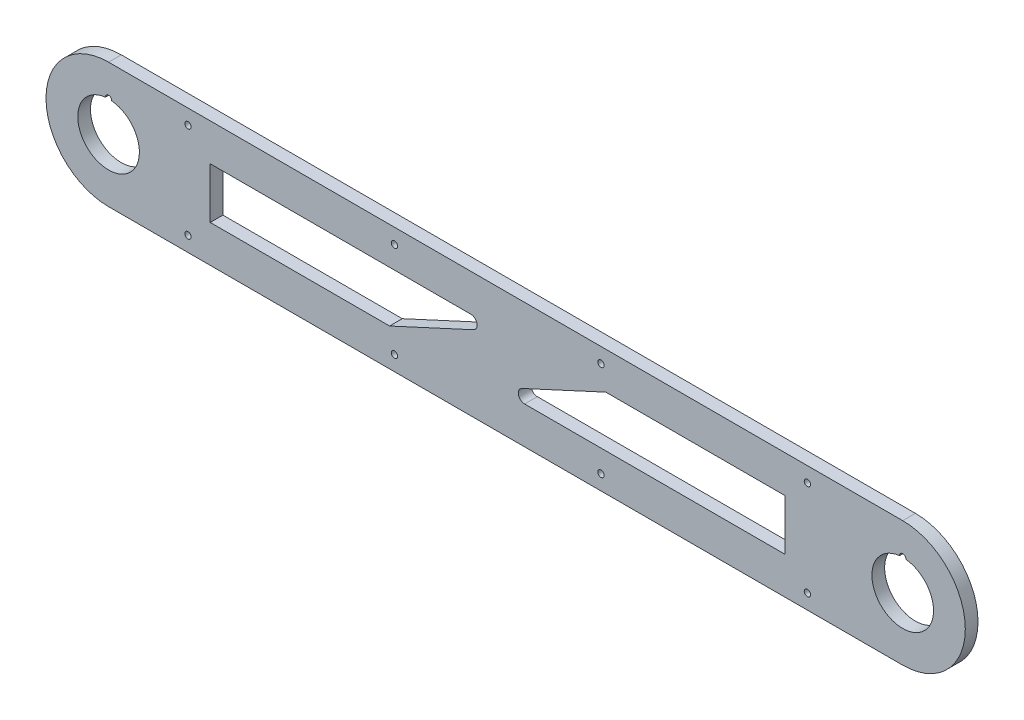
ISO-10303-21;
HEADER;
FILE_DESCRIPTION(('STEP AP214'),'2;1');
FILE_NAME('part.step','',(''),(''),'','','');
FILE_SCHEMA(('AUTOMOTIVE_DESIGN { 1 0 10303 214 1 1 1 1 }'));
ENDSEC;
DATA;
#1=APPLICATION_CONTEXT('core data for automotive mechanical design processes');
#2=APPLICATION_PROTOCOL_DEFINITION('international standard','automotive_design',2000,#1);
#3=PRODUCT_CONTEXT('',#1,'mechanical');
#4=PRODUCT('Part','Part','',(#3));
#5=PRODUCT_RELATED_PRODUCT_CATEGORY('part','',(#4));
#6=PRODUCT_DEFINITION_FORMATION('','',#4);
#7=PRODUCT_DEFINITION_CONTEXT('part definition',#1,'design');
#8=PRODUCT_DEFINITION('design','',#6,#7);
#9=PRODUCT_DEFINITION_SHAPE('','',#8);
#10=(LENGTH_UNIT() NAMED_UNIT(*) SI_UNIT(.MILLI.,.METRE.));
#11=(NAMED_UNIT(*) PLANE_ANGLE_UNIT() SI_UNIT($,.RADIAN.));
#12=(NAMED_UNIT(*) SI_UNIT($,.STERADIAN.) SOLID_ANGLE_UNIT());
#13=UNCERTAINTY_MEASURE_WITH_UNIT(LENGTH_MEASURE(1.E-05),#10,'distance_accuracy_value','');
#14=(GEOMETRIC_REPRESENTATION_CONTEXT(3) GLOBAL_UNCERTAINTY_ASSIGNED_CONTEXT((#13)) GLOBAL_UNIT_ASSIGNED_CONTEXT((#10,
#11,#12)) REPRESENTATION_CONTEXT('',''));
#15=CARTESIAN_POINT('',(0.,0.,0.));
#16=DIRECTION('',(0.,0.,1.));
#17=DIRECTION('',(1.,0.,0.));
#18=AXIS2_PLACEMENT_3D('',#15,#16,#17);
#19=CARTESIAN_POINT('',(0.,0.,4.));
#20=DIRECTION('',(0.,0.,1.));
#21=DIRECTION('',(1.,0.,0.));
#22=AXIS2_PLACEMENT_3D('',#19,#20,#21);
#23=PLANE('',#22);
#24=CARTESIAN_POINT('',(0.,9.7,4.));
#25=DIRECTION('',(0.,0.,1.));
#26=DIRECTION('',(1.,0.,0.));
#27=AXIS2_PLACEMENT_3D('',#24,#25,#26);
#28=CIRCLE('',#27,1.);
#29=CARTESIAN_POINT('',(0.998670601097925,9.64845360824742,4.));
#30=VERTEX_POINT('',#29);
#31=CARTESIAN_POINT('',(-0.998670601097925,9.64845360824742,4.));
#32=VERTEX_POINT('',#31);
#33=EDGE_CURVE('E53',#30,#32,#28,.T.);
#34=ORIENTED_EDGE('',*,*,#33,.F.);
#35=CARTESIAN_POINT('',(0.,0.,4.));
#36=DIRECTION('',(0.,0.,1.));
#37=DIRECTION('',(1.,0.,0.));
#38=AXIS2_PLACEMENT_3D('',#35,#36,#37);
#39=CIRCLE('',#38,9.7);
#40=EDGE_CURVE('E186',#32,#30,#39,.T.);
#41=ORIENTED_EDGE('',*,*,#40,.F.);
#42=EDGE_LOOP('',(#34,#41));
#43=FACE_BOUND('',#42,.T.);
#44=CARTESIAN_POINT('',(250.,9.69999999999999,4.));
#45=DIRECTION('',(0.,0.,1.));
#46=DIRECTION('',(1.,0.,0.));
#47=AXIS2_PLACEMENT_3D('',#44,#45,#46);
#48=CIRCLE('',#47,0.999999999999998);
#49=CARTESIAN_POINT('',(250.998670601098,9.64845360824742,4.));
#50=VERTEX_POINT('',#49);
#51=CARTESIAN_POINT('',(249.001329398902,9.64845360824742,4.));
#52=VERTEX_POINT('',#51);
#53=EDGE_CURVE('E61',#50,#52,#48,.T.);
#54=ORIENTED_EDGE('',*,*,#53,.F.);
#55=CARTESIAN_POINT('',(250.,0.,4.));
#56=DIRECTION('',(0.,0.,1.));
#57=DIRECTION('',(1.,0.,0.));
#58=AXIS2_PLACEMENT_3D('',#55,#56,#57);
#59=CIRCLE('',#58,9.7);
#60=EDGE_CURVE('E175',#52,#50,#59,.T.);
#61=ORIENTED_EDGE('',*,*,#60,.F.);
#62=EDGE_LOOP('',(#54,#61));
#63=FACE_BOUND('',#62,.T.);
#64=CARTESIAN_POINT('',(130.976731594915,-6.,4.));
#65=DIRECTION('',(0.,0.,1.));
#66=DIRECTION('',(-1.,0.,0.));
#67=AXIS2_PLACEMENT_3D('',#64,#65,#66);
#68=CIRCLE('',#67,2.);
#69=CARTESIAN_POINT('',(130.138615239991,-4.18408123099903,4.));
#70=VERTEX_POINT('',#69);
#71=CARTESIAN_POINT('',(130.976731594915,-8.,4.));
#72=VERTEX_POINT('',#71);
#73=EDGE_CURVE('E332',#70,#72,#68,.T.);
#74=ORIENTED_EDGE('',*,*,#73,.F.);
#75=DIRECTION('',(-0.907959384500451,-0.419058177461749,0.));
#76=VECTOR('',#75,1.);
#77=CARTESIAN_POINT('',(156.537457907156,8.,4.));
#78=LINE('',#77,#76);
#79=CARTESIAN_POINT('',(156.537457907156,8.,4.));
#80=VERTEX_POINT('',#79);
#81=EDGE_CURVE('E348',#80,#70,#78,.T.);
#82=ORIENTED_EDGE('',*,*,#81,.F.);
#83=DIRECTION('',(-1.,0.,0.));
#84=VECTOR('',#83,1.);
#85=CARTESIAN_POINT('',(156.537457907156,8.,4.));
#86=LINE('',#85,#84);
#87=CARTESIAN_POINT('',(213.,8.,4.));
#88=VERTEX_POINT('',#87);
#89=EDGE_CURVE('E344',#88,#80,#86,.T.);
#90=ORIENTED_EDGE('',*,*,#89,.F.);
#91=DIRECTION('',(0.,1.,0.));
#92=VECTOR('',#91,1.);
#93=CARTESIAN_POINT('',(213.,8.,4.));
#94=LINE('',#93,#92);
#95=CARTESIAN_POINT('',(213.,-8.,4.));
#96=VERTEX_POINT('',#95);
#97=EDGE_CURVE('E340',#96,#88,#94,.T.);
#98=ORIENTED_EDGE('',*,*,#97,.F.);
#99=DIRECTION('',(1.,0.,0.));
#100=VECTOR('',#99,1.);
#101=CARTESIAN_POINT('',(213.,-8.,4.));
#102=LINE('',#101,#100);
#103=EDGE_CURVE('E335',#72,#96,#102,.T.);
#104=ORIENTED_EDGE('',*,*,#103,.F.);
#105=EDGE_LOOP('',(#74,#82,#90,#98,#104));
#106=FACE_BOUND('',#105,.T.);
#107=DIRECTION('',(0.,-1.,0.));
#108=VECTOR('',#107,1.);
#109=CARTESIAN_POINT('',(32.0000000000003,-8.,4.));
#110=LINE('',#109,#108);
#111=CARTESIAN_POINT('',(32.0000000000003,8.,4.));
#112=VERTEX_POINT('',#111);
#113=CARTESIAN_POINT('',(32.0000000000003,-8.,4.));
#114=VERTEX_POINT('',#113);
#115=EDGE_CURVE('E323',#112,#114,#110,.T.);
#116=ORIENTED_EDGE('',*,*,#115,.F.);
#117=DIRECTION('',(-1.,0.,0.));
#118=VECTOR('',#117,1.);
#119=CARTESIAN_POINT('',(32.0000000000003,8.,4.));
#120=LINE('',#119,#118);
#121=CARTESIAN_POINT('',(114.023268405086,8.,4.));
#122=VERTEX_POINT('',#121);
#123=EDGE_CURVE('E383',#122,#112,#120,.T.);
#124=ORIENTED_EDGE('',*,*,#123,.F.);
#125=CARTESIAN_POINT('',(114.023268405086,6.,4.));
#126=DIRECTION('',(0.,0.,1.));
#127=DIRECTION('',(1.,0.,0.));
#128=AXIS2_PLACEMENT_3D('',#125,#126,#127);
#129=CIRCLE('',#128,2.);
#130=CARTESIAN_POINT('',(114.861384760009,4.18408123099904,4.));
#131=VERTEX_POINT('',#130);
#132=EDGE_CURVE('E379',#131,#122,#129,.T.);
#133=ORIENTED_EDGE('',*,*,#132,.F.);
#134=DIRECTION('',(0.907959384500451,0.419058177461749,0.));
#135=VECTOR('',#134,1.);
#136=CARTESIAN_POINT('',(114.861384760009,4.18408123099903,4.));
#137=LINE('',#136,#135);
#138=CARTESIAN_POINT('',(88.4625420928446,-8.,4.));
#139=VERTEX_POINT('',#138);
#140=EDGE_CURVE('E375',#139,#131,#137,.T.);
#141=ORIENTED_EDGE('',*,*,#140,.F.);
#142=DIRECTION('',(1.,0.,0.));
#143=VECTOR('',#142,1.);
#144=CARTESIAN_POINT('',(88.4625420928446,-8.,4.));
#145=LINE('',#144,#143);
#146=EDGE_CURVE('E371',#114,#139,#145,.T.);
#147=ORIENTED_EDGE('',*,*,#146,.F.);
#148=EDGE_LOOP('',(#116,#124,#133,#141,#147));
#149=FACE_BOUND('',#148,.T.);
#150=CARTESIAN_POINT('',(90.0000000000003,-15.,4.));
#151=DIRECTION('',(0.,0.,1.));
#152=DIRECTION('',(1.,0.,0.));
#153=AXIS2_PLACEMENT_3D('',#150,#151,#152);
#154=CIRCLE('',#153,0.999999999999998);
#155=CARTESIAN_POINT('',(91.0000000000003,-15.,4.));
#156=VERTEX_POINT('',#155);
#157=EDGE_CURVE('E406',#156,#156,#154,.T.);
#158=ORIENTED_EDGE('',*,*,#157,.F.);
#159=EDGE_LOOP('',(#158));
#160=FACE_BOUND('',#159,.T.);
#161=CARTESIAN_POINT('',(220.,15.,4.));
#162=DIRECTION('',(0.,0.,1.));
#163=DIRECTION('',(1.,0.,0.));
#164=AXIS2_PLACEMENT_3D('',#161,#162,#163);
#165=CIRCLE('',#164,0.999999999999998);
#166=CARTESIAN_POINT('',(221.,15.,4.));
#167=VERTEX_POINT('',#166);
#168=EDGE_CURVE('E414',#167,#167,#165,.T.);
#169=ORIENTED_EDGE('',*,*,#168,.F.);
#170=EDGE_LOOP('',(#169));
#171=FACE_BOUND('',#170,.T.);
#172=CARTESIAN_POINT('',(155.,15.,4.));
#173=DIRECTION('',(0.,0.,1.));
#174=DIRECTION('',(1.,0.,0.));
#175=AXIS2_PLACEMENT_3D('',#172,#173,#174);
#176=CIRCLE('',#175,0.999999999999998);
#177=CARTESIAN_POINT('',(156.,15.,4.));
#178=VERTEX_POINT('',#177);
#179=EDGE_CURVE('E418',#178,#178,#176,.T.);
#180=ORIENTED_EDGE('',*,*,#179,.F.);
#181=EDGE_LOOP('',(#180));
#182=FACE_BOUND('',#181,.T.);
#183=CARTESIAN_POINT('',(90.,15.,4.));
#184=DIRECTION('',(0.,0.,1.));
#185=DIRECTION('',(1.,0.,0.));
#186=AXIS2_PLACEMENT_3D('',#183,#184,#185);
#187=CIRCLE('',#186,1.00000000000001);
#188=CARTESIAN_POINT('',(91.,15.,4.));
#189=VERTEX_POINT('',#188);
#190=EDGE_CURVE('E422',#189,#189,#187,.T.);
#191=ORIENTED_EDGE('',*,*,#190,.F.);
#192=EDGE_LOOP('',(#191));
#193=FACE_BOUND('',#192,.T.);
#194=CARTESIAN_POINT('',(155.,-15.,4.));
#195=DIRECTION('',(0.,0.,1.));
#196=DIRECTION('',(1.,0.,0.));
#197=AXIS2_PLACEMENT_3D('',#194,#195,#196);
#198=CIRCLE('',#197,0.999999999999998);
#199=CARTESIAN_POINT('',(156.,-15.,4.));
#200=VERTEX_POINT('',#199);
#201=EDGE_CURVE('E402',#200,#200,#198,.T.);
#202=ORIENTED_EDGE('',*,*,#201,.F.);
#203=EDGE_LOOP('',(#202));
#204=FACE_BOUND('',#203,.T.);
#205=CARTESIAN_POINT('',(220.,-15.,4.));
#206=DIRECTION('',(0.,0.,1.));
#207=DIRECTION('',(1.,0.,0.));
#208=AXIS2_PLACEMENT_3D('',#205,#206,#207);
#209=CIRCLE('',#208,0.999999999999998);
#210=CARTESIAN_POINT('',(221.,-15.,4.));
#211=VERTEX_POINT('',#210);
#212=EDGE_CURVE('E407',#211,#211,#209,.T.);
#213=ORIENTED_EDGE('',*,*,#212,.F.);
#214=EDGE_LOOP('',(#213));
#215=FACE_BOUND('',#214,.T.);
#216=CARTESIAN_POINT('',(25.0000000000003,-15.,4.));
#217=DIRECTION('',(0.,0.,1.));
#218=DIRECTION('',(1.,0.,0.));
#219=AXIS2_PLACEMENT_3D('',#216,#217,#218);
#220=CIRCLE('',#219,1.);
#221=CARTESIAN_POINT('',(26.0000000000003,-15.,4.));
#222=VERTEX_POINT('',#221);
#223=EDGE_CURVE('E356',#222,#222,#220,.T.);
#224=ORIENTED_EDGE('',*,*,#223,.F.);
#225=EDGE_LOOP('',(#224));
#226=FACE_BOUND('',#225,.T.);
#227=CARTESIAN_POINT('',(25.,15.,4.));
#228=DIRECTION('',(0.,0.,1.));
#229=DIRECTION('',(1.,0.,0.));
#230=AXIS2_PLACEMENT_3D('',#227,#228,#229);
#231=CIRCLE('',#230,1.);
#232=CARTESIAN_POINT('',(26.,15.,4.));
#233=VERTEX_POINT('',#232);
#234=EDGE_CURVE('E191',#233,#233,#231,.T.);
#235=ORIENTED_EDGE('',*,*,#234,.F.);
#236=EDGE_LOOP('',(#235));
#237=FACE_BOUND('',#236,.T.);
#238=CARTESIAN_POINT('',(0.,0.,4.));
#239=DIRECTION('',(0.,0.,1.));
#240=DIRECTION('',(1.,0.,0.));
#241=AXIS2_PLACEMENT_3D('',#238,#239,#240);
#242=CIRCLE('',#241,19.7);
#243=CARTESIAN_POINT('',(0.,19.7,4.));
#244=VERTEX_POINT('',#243);
#245=CARTESIAN_POINT('',(0.,-19.7,4.));
#246=VERTEX_POINT('',#245);
#247=EDGE_CURVE('E198',#244,#246,#242,.T.);
#248=ORIENTED_EDGE('',*,*,#247,.T.);
#249=DIRECTION('',(1.,0.,0.));
#250=VECTOR('',#249,1.);
#251=CARTESIAN_POINT('',(0.,-19.7,4.));
#252=LINE('',#251,#250);
#253=CARTESIAN_POINT('',(250.,-19.7,4.));
#254=VERTEX_POINT('',#253);
#255=EDGE_CURVE('E202',#246,#254,#252,.T.);
#256=ORIENTED_EDGE('',*,*,#255,.T.);
#257=CARTESIAN_POINT('',(250.,0.,4.));
#258=DIRECTION('',(0.,0.,1.));
#259=DIRECTION('',(-1.,0.,0.));
#260=AXIS2_PLACEMENT_3D('',#257,#258,#259);
#261=CIRCLE('',#260,19.7);
#262=CARTESIAN_POINT('',(250.,19.7,4.));
#263=VERTEX_POINT('',#262);
#264=EDGE_CURVE('E206',#254,#263,#261,.T.);
#265=ORIENTED_EDGE('',*,*,#264,.T.);
#266=DIRECTION('',(-1.,0.,0.));
#267=VECTOR('',#266,1.);
#268=CARTESIAN_POINT('',(0.,19.7,4.));
#269=LINE('',#268,#267);
#270=EDGE_CURVE('E209',#263,#244,#269,.T.);
#271=ORIENTED_EDGE('',*,*,#270,.T.);
#272=EDGE_LOOP('',(#248,#256,#265,#271));
#273=FACE_BOUND('',#272,.T.);
#274=ADVANCED_FACE('F38',(#43,#63,#106,#149,#160,#171,#182,#193,#204,#215,#226,#237,#273),#23,.T.);
#275=CARTESIAN_POINT('',(0.,0.,0.));
#276=DIRECTION('',(0.,0.,1.));
#277=DIRECTION('',(1.,0.,0.));
#278=AXIS2_PLACEMENT_3D('',#275,#276,#277);
#279=PLANE('',#278);
#280=DIRECTION('',(-0.907959384500451,-0.419058177461749,0.));
#281=VECTOR('',#280,1.);
#282=CARTESIAN_POINT('',(24.4456023641837,-52.9654717890643,0.));
#283=LINE('',#282,#281);
#284=CARTESIAN_POINT('',(156.537457907156,8.,0.));
#285=VERTEX_POINT('',#284);
#286=CARTESIAN_POINT('',(130.138615239991,-4.18408123099903,0.));
#287=VERTEX_POINT('',#286);
#288=EDGE_CURVE('E302',#285,#287,#283,.T.);
#289=ORIENTED_EDGE('',*,*,#288,.T.);
#290=CARTESIAN_POINT('',(130.976731594915,-6.,0.));
#291=DIRECTION('',(0.,0.,1.));
#292=DIRECTION('',(1.,0.,0.));
#293=AXIS2_PLACEMENT_3D('',#290,#291,#292);
#294=CIRCLE('',#293,2.);
#295=CARTESIAN_POINT('',(130.976731594915,-8.,0.));
#296=VERTEX_POINT('',#295);
#297=EDGE_CURVE('E306',#287,#296,#294,.T.);
#298=ORIENTED_EDGE('',*,*,#297,.T.);
#299=DIRECTION('',(1.,0.,0.));
#300=VECTOR('',#299,1.);
#301=CARTESIAN_POINT('',(0.,-8.,0.));
#302=LINE('',#301,#300);
#303=CARTESIAN_POINT('',(213.,-8.,0.));
#304=VERTEX_POINT('',#303);
#305=EDGE_CURVE('E290',#296,#304,#302,.T.);
#306=ORIENTED_EDGE('',*,*,#305,.T.);
#307=DIRECTION('',(0.,1.,0.));
#308=VECTOR('',#307,1.);
#309=CARTESIAN_POINT('',(213.,0.,0.));
#310=LINE('',#309,#308);
#311=CARTESIAN_POINT('',(213.,8.,0.));
#312=VERTEX_POINT('',#311);
#313=EDGE_CURVE('E294',#304,#312,#310,.T.);
#314=ORIENTED_EDGE('',*,*,#313,.T.);
#315=DIRECTION('',(-1.,0.,0.));
#316=VECTOR('',#315,1.);
#317=CARTESIAN_POINT('',(0.,8.,0.));
#318=LINE('',#317,#316);
#319=EDGE_CURVE('E298',#312,#285,#318,.T.);
#320=ORIENTED_EDGE('',*,*,#319,.T.);
#321=EDGE_LOOP('',(#289,#298,#306,#314,#320));
#322=FACE_BOUND('',#321,.T.);
#323=DIRECTION('',(-1.,0.,0.));
#324=VECTOR('',#323,1.);
#325=CARTESIAN_POINT('',(0.,8.,0.));
#326=LINE('',#325,#324);
#327=CARTESIAN_POINT('',(114.023268405086,8.,0.));
#328=VERTEX_POINT('',#327);
#329=CARTESIAN_POINT('',(32.0000000000003,8.,0.));
#330=VERTEX_POINT('',#329);
#331=EDGE_CURVE('E282',#328,#330,#326,.T.);
#332=ORIENTED_EDGE('',*,*,#331,.T.);
#333=DIRECTION('',(0.,-1.,0.));
#334=VECTOR('',#333,1.);
#335=CARTESIAN_POINT('',(32.0000000000003,0.,0.));
#336=LINE('',#335,#334);
#337=CARTESIAN_POINT('',(32.0000000000003,-8.,0.));
#338=VERTEX_POINT('',#337);
#339=EDGE_CURVE('E286',#330,#338,#336,.T.);
#340=ORIENTED_EDGE('',*,*,#339,.T.);
#341=DIRECTION('',(1.,0.,0.));
#342=VECTOR('',#341,1.);
#343=CARTESIAN_POINT('',(0.,-8.,0.));
#344=LINE('',#343,#342);
#345=CARTESIAN_POINT('',(88.4625420928446,-8.,0.));
#346=VERTEX_POINT('',#345);
#347=EDGE_CURVE('E239',#338,#346,#344,.T.);
#348=ORIENTED_EDGE('',*,*,#347,.T.);
#349=DIRECTION('',(0.907959384500451,0.419058177461749,0.));
#350=VECTOR('',#349,1.);
#351=CARTESIAN_POINT('',(18.5787878797192,-40.254040406058,0.));
#352=LINE('',#351,#350);
#353=CARTESIAN_POINT('',(114.861384760009,4.18408123099904,0.));
#354=VERTEX_POINT('',#353);
#355=EDGE_CURVE('E274',#346,#354,#352,.T.);
#356=ORIENTED_EDGE('',*,*,#355,.T.);
#357=CARTESIAN_POINT('',(114.023268405086,6.,0.));
#358=DIRECTION('',(0.,0.,1.));
#359=DIRECTION('',(1.,0.,0.));
#360=AXIS2_PLACEMENT_3D('',#357,#358,#359);
#361=CIRCLE('',#360,2.);
#362=EDGE_CURVE('E278',#354,#328,#361,.T.);
#363=ORIENTED_EDGE('',*,*,#362,.T.);
#364=EDGE_LOOP('',(#332,#340,#348,#356,#363));
#365=FACE_BOUND('',#364,.T.);
#366=CARTESIAN_POINT('',(90.0000000000003,-15.,0.));
#367=DIRECTION('',(0.,0.,1.));
#368=DIRECTION('',(1.,0.,0.));
#369=AXIS2_PLACEMENT_3D('',#366,#367,#368);
#370=CIRCLE('',#369,0.999999999999998);
#371=CARTESIAN_POINT('',(91.0000000000003,-15.,0.));
#372=VERTEX_POINT('',#371);
#373=EDGE_CURVE('E188',#372,#372,#370,.T.);
#374=ORIENTED_EDGE('',*,*,#373,.T.);
#375=EDGE_LOOP('',(#374));
#376=FACE_BOUND('',#375,.T.);
#377=CARTESIAN_POINT('',(220.,15.,0.));
#378=DIRECTION('',(0.,0.,1.));
#379=DIRECTION('',(1.,0.,0.));
#380=AXIS2_PLACEMENT_3D('',#377,#378,#379);
#381=CIRCLE('',#380,0.999999999999998);
#382=CARTESIAN_POINT('',(221.,15.,0.));
#383=VERTEX_POINT('',#382);
#384=EDGE_CURVE('E264',#383,#383,#381,.T.);
#385=ORIENTED_EDGE('',*,*,#384,.T.);
#386=EDGE_LOOP('',(#385));
#387=FACE_BOUND('',#386,.T.);
#388=CARTESIAN_POINT('',(155.,15.,0.));
#389=DIRECTION('',(0.,0.,1.));
#390=DIRECTION('',(1.,0.,0.));
#391=AXIS2_PLACEMENT_3D('',#388,#389,#390);
#392=CIRCLE('',#391,0.999999999999998);
#393=CARTESIAN_POINT('',(156.,15.,0.));
#394=VERTEX_POINT('',#393);
#395=EDGE_CURVE('E260',#394,#394,#392,.T.);
#396=ORIENTED_EDGE('',*,*,#395,.T.);
#397=EDGE_LOOP('',(#396));
#398=FACE_BOUND('',#397,.T.);
#399=CARTESIAN_POINT('',(90.,15.,0.));
#400=DIRECTION('',(0.,0.,1.));
#401=DIRECTION('',(1.,0.,0.));
#402=AXIS2_PLACEMENT_3D('',#399,#400,#401);
#403=CIRCLE('',#402,1.00000000000001);
#404=CARTESIAN_POINT('',(91.,15.,0.));
#405=VERTEX_POINT('',#404);
#406=EDGE_CURVE('E256',#405,#405,#403,.T.);
#407=ORIENTED_EDGE('',*,*,#406,.T.);
#408=EDGE_LOOP('',(#407));
#409=FACE_BOUND('',#408,.T.);
#410=CARTESIAN_POINT('',(155.,-15.,0.));
#411=DIRECTION('',(0.,0.,1.));
#412=DIRECTION('',(1.,0.,0.));
#413=AXIS2_PLACEMENT_3D('',#410,#411,#412);
#414=CIRCLE('',#413,0.999999999999998);
#415=CARTESIAN_POINT('',(156.,-15.,0.));
#416=VERTEX_POINT('',#415);
#417=EDGE_CURVE('E252',#416,#416,#414,.T.);
#418=ORIENTED_EDGE('',*,*,#417,.T.);
#419=EDGE_LOOP('',(#418));
#420=FACE_BOUND('',#419,.T.);
#421=CARTESIAN_POINT('',(220.,-15.,0.));
#422=DIRECTION('',(0.,0.,1.));
#423=DIRECTION('',(1.,0.,0.));
#424=AXIS2_PLACEMENT_3D('',#421,#422,#423);
#425=CIRCLE('',#424,0.999999999999998);
#426=CARTESIAN_POINT('',(221.,-15.,0.));
#427=VERTEX_POINT('',#426);
#428=EDGE_CURVE('E248',#427,#427,#425,.T.);
#429=ORIENTED_EDGE('',*,*,#428,.T.);
#430=EDGE_LOOP('',(#429));
#431=FACE_BOUND('',#430,.T.);
#432=CARTESIAN_POINT('',(25.0000000000003,-15.,0.));
#433=DIRECTION('',(0.,0.,1.));
#434=DIRECTION('',(1.,0.,0.));
#435=AXIS2_PLACEMENT_3D('',#432,#433,#434);
#436=CIRCLE('',#435,1.);
#437=CARTESIAN_POINT('',(26.0000000000003,-15.,0.));
#438=VERTEX_POINT('',#437);
#439=EDGE_CURVE('E244',#438,#438,#436,.T.);
#440=ORIENTED_EDGE('',*,*,#439,.T.);
#441=EDGE_LOOP('',(#440));
#442=FACE_BOUND('',#441,.T.);
#443=CARTESIAN_POINT('',(25.,15.,0.));
#444=DIRECTION('',(0.,0.,1.));
#445=DIRECTION('',(1.,0.,0.));
#446=AXIS2_PLACEMENT_3D('',#443,#444,#445);
#447=CIRCLE('',#446,1.);
#448=CARTESIAN_POINT('',(26.,15.,0.));
#449=VERTEX_POINT('',#448);
#450=EDGE_CURVE('E240',#449,#449,#447,.T.);
#451=ORIENTED_EDGE('',*,*,#450,.T.);
#452=EDGE_LOOP('',(#451));
#453=FACE_BOUND('',#452,.T.);
#454=CARTESIAN_POINT('',(0.,0.,0.));
#455=DIRECTION('',(0.,0.,1.));
#456=DIRECTION('',(1.,0.,0.));
#457=AXIS2_PLACEMENT_3D('',#454,#455,#456);
#458=CIRCLE('',#457,19.7);
#459=CARTESIAN_POINT('',(0.,19.7,0.));
#460=VERTEX_POINT('',#459);
#461=CARTESIAN_POINT('',(0.,-19.7,0.));
#462=VERTEX_POINT('',#461);
#463=EDGE_CURVE('E196',#460,#462,#458,.T.);
#464=ORIENTED_EDGE('',*,*,#463,.F.);
#465=DIRECTION('',(-1.,0.,0.));
#466=VECTOR('',#465,1.);
#467=CARTESIAN_POINT('',(0.,19.7,0.));
#468=LINE('',#467,#466);
#469=CARTESIAN_POINT('',(250.,19.7,0.));
#470=VERTEX_POINT('',#469);
#471=EDGE_CURVE('E203',#470,#460,#468,.T.);
#472=ORIENTED_EDGE('',*,*,#471,.F.);
#473=CARTESIAN_POINT('',(250.,0.,0.));
#474=DIRECTION('',(0.,0.,1.));
#475=DIRECTION('',(-1.,0.,0.));
#476=AXIS2_PLACEMENT_3D('',#473,#474,#475);
#477=CIRCLE('',#476,19.7);
#478=CARTESIAN_POINT('',(250.,-19.7,0.));
#479=VERTEX_POINT('',#478);
#480=EDGE_CURVE('E219',#479,#470,#477,.T.);
#481=ORIENTED_EDGE('',*,*,#480,.F.);
#482=DIRECTION('',(1.,0.,0.));
#483=VECTOR('',#482,1.);
#484=CARTESIAN_POINT('',(0.,-19.7,0.));
#485=LINE('',#484,#483);
#486=EDGE_CURVE('E216',#462,#479,#485,.T.);
#487=ORIENTED_EDGE('',*,*,#486,.F.);
#488=EDGE_LOOP('',(#464,#472,#481,#487));
#489=FACE_BOUND('',#488,.T.);
#490=CARTESIAN_POINT('',(0.,0.,0.));
#491=DIRECTION('',(0.,0.,1.));
#492=DIRECTION('',(1.,0.,0.));
#493=AXIS2_PLACEMENT_3D('',#490,#491,#492);
#494=CIRCLE('',#493,9.7);
#495=CARTESIAN_POINT('',(-0.998670601097924,9.64845360824742,0.));
#496=VERTEX_POINT('',#495);
#497=CARTESIAN_POINT('',(0.998670601097931,9.64845360824742,0.));
#498=VERTEX_POINT('',#497);
#499=EDGE_CURVE('E180',#496,#498,#494,.T.);
#500=ORIENTED_EDGE('',*,*,#499,.T.);
#501=CARTESIAN_POINT('',(0.,9.7,0.));
#502=DIRECTION('',(0.,0.,1.));
#503=DIRECTION('',(1.,0.,0.));
#504=AXIS2_PLACEMENT_3D('',#501,#502,#503);
#505=CIRCLE('',#504,1.);
#506=EDGE_CURVE('E314',#498,#496,#505,.T.);
#507=ORIENTED_EDGE('',*,*,#506,.T.);
#508=EDGE_LOOP('',(#500,#507));
#509=FACE_BOUND('',#508,.T.);
#510=CARTESIAN_POINT('',(250.,0.,0.));
#511=DIRECTION('',(0.,0.,1.));
#512=DIRECTION('',(1.,0.,0.));
#513=AXIS2_PLACEMENT_3D('',#510,#511,#512);
#514=CIRCLE('',#513,9.7);
#515=CARTESIAN_POINT('',(249.001329398902,9.64845360824742,0.));
#516=VERTEX_POINT('',#515);
#517=CARTESIAN_POINT('',(250.998670601098,9.64845360824742,0.));
#518=VERTEX_POINT('',#517);
#519=EDGE_CURVE('E181',#516,#518,#514,.T.);
#520=ORIENTED_EDGE('',*,*,#519,.T.);
#521=CARTESIAN_POINT('',(250.,9.69999999999999,0.));
#522=DIRECTION('',(0.,0.,1.));
#523=DIRECTION('',(1.,0.,0.));
#524=AXIS2_PLACEMENT_3D('',#521,#522,#523);
#525=CIRCLE('',#524,0.999999999999998);
#526=EDGE_CURVE('E164',#518,#516,#525,.T.);
#527=ORIENTED_EDGE('',*,*,#526,.T.);
#528=EDGE_LOOP('',(#520,#527));
#529=FACE_BOUND('',#528,.T.);
#530=ADVANCED_FACE('F320',(#322,#365,#376,#387,#398,#409,#420,#431,#442,#453,#489,#509,#529),
#279,.F.);
#531=CARTESIAN_POINT('',(0.,0.,4.));
#532=DIRECTION('',(0.,0.,-1.));
#533=DIRECTION('',(-1.,0.,0.));
#534=AXIS2_PLACEMENT_3D('',#531,#532,#533);
#535=CYLINDRICAL_SURFACE('',#534,19.7);
#536=ORIENTED_EDGE('',*,*,#463,.T.);
#537=DIRECTION('',(0.,0.,-1.));
#538=VECTOR('',#537,1.);
#539=CARTESIAN_POINT('',(0.,-19.7,4.));
#540=LINE('',#539,#538);
#541=EDGE_CURVE('E235',#246,#462,#540,.T.);
#542=ORIENTED_EDGE('',*,*,#541,.F.);
#543=ORIENTED_EDGE('',*,*,#247,.F.);
#544=DIRECTION('',(0.,0.,-1.));
#545=VECTOR('',#544,1.);
#546=CARTESIAN_POINT('',(0.,19.7,4.));
#547=LINE('',#546,#545);
#548=EDGE_CURVE('E212',#244,#460,#547,.T.);
#549=ORIENTED_EDGE('',*,*,#548,.T.);
#550=EDGE_LOOP('',(#536,#542,#543,#549));
#551=FACE_BOUND('',#550,.T.);
#552=ADVANCED_FACE('F40',(#551),#535,.T.);
#553=CARTESIAN_POINT('',(0.,-19.7,4.));
#554=DIRECTION('',(0.,1.,0.));
#555=DIRECTION('',(-1.,0.,0.));
#556=AXIS2_PLACEMENT_3D('',#553,#554,#555);
#557=PLANE('',#556);
#558=ORIENTED_EDGE('',*,*,#486,.T.);
#559=DIRECTION('',(0.,0.,-1.));
#560=VECTOR('',#559,1.);
#561=CARTESIAN_POINT('',(250.,-19.7,4.));
#562=LINE('',#561,#560);
#563=EDGE_CURVE('E231',#254,#479,#562,.T.);
#564=ORIENTED_EDGE('',*,*,#563,.F.);
#565=ORIENTED_EDGE('',*,*,#255,.F.);
#566=ORIENTED_EDGE('',*,*,#541,.T.);
#567=EDGE_LOOP('',(#558,#564,#565,#566));
#568=FACE_BOUND('',#567,.T.);
#569=ADVANCED_FACE('F454',(#568),#557,.F.);
#570=CARTESIAN_POINT('',(250.,0.,4.));
#571=DIRECTION('',(0.,0.,-1.));
#572=DIRECTION('',(-1.,0.,0.));
#573=AXIS2_PLACEMENT_3D('',#570,#571,#572);
#574=CYLINDRICAL_SURFACE('',#573,19.7);
#575=ORIENTED_EDGE('',*,*,#480,.T.);
#576=DIRECTION('',(0.,0.,-1.));
#577=VECTOR('',#576,1.);
#578=CARTESIAN_POINT('',(250.,19.7,4.));
#579=LINE('',#578,#577);
#580=EDGE_CURVE('E227',#263,#470,#579,.T.);
#581=ORIENTED_EDGE('',*,*,#580,.F.);
#582=ORIENTED_EDGE('',*,*,#264,.F.);
#583=ORIENTED_EDGE('',*,*,#563,.T.);
#584=EDGE_LOOP('',(#575,#581,#582,#583));
#585=FACE_BOUND('',#584,.T.);
#586=ADVANCED_FACE('F459',(#585),#574,.T.);
#587=CARTESIAN_POINT('',(0.,19.7,4.));
#588=DIRECTION('',(0.,-1.,0.));
#589=DIRECTION('',(1.,0.,0.));
#590=AXIS2_PLACEMENT_3D('',#587,#588,#589);
#591=PLANE('',#590);
#592=ORIENTED_EDGE('',*,*,#471,.T.);
#593=ORIENTED_EDGE('',*,*,#548,.F.);
#594=ORIENTED_EDGE('',*,*,#270,.F.);
#595=ORIENTED_EDGE('',*,*,#580,.T.);
#596=EDGE_LOOP('',(#592,#593,#594,#595));
#597=FACE_BOUND('',#596,.T.);
#598=ADVANCED_FACE('F462',(#597),#591,.F.);
#599=CARTESIAN_POINT('',(0.,0.,4.));
#600=DIRECTION('',(0.,0.,-1.));
#601=DIRECTION('',(-1.,0.,0.));
#602=AXIS2_PLACEMENT_3D('',#599,#600,#601);
#603=CYLINDRICAL_SURFACE('',#602,9.7);
#604=DIRECTION('',(0.,0.,1.));
#605=VECTOR('',#604,1.);
#606=CARTESIAN_POINT('',(0.998670601097925,9.64845360824742,-1.));
#607=LINE('',#606,#605);
#608=EDGE_CURVE('E11',#498,#30,#607,.T.);
#609=ORIENTED_EDGE('',*,*,#608,.F.);
#610=ORIENTED_EDGE('',*,*,#499,.F.);
#611=DIRECTION('',(0.,0.,1.));
#612=VECTOR('',#611,1.);
#613=CARTESIAN_POINT('',(-0.998670601097925,9.64845360824742,-1.));
#614=LINE('',#613,#612);
#615=EDGE_CURVE('E47',#32,#496,#614,.F.);
#616=ORIENTED_EDGE('',*,*,#615,.F.);
#617=ORIENTED_EDGE('',*,*,#40,.T.);
#618=EDGE_LOOP('',(#609,#610,#616,#617));
#619=FACE_BOUND('',#618,.T.);
#620=ADVANCED_FACE('F325',(#619),#603,.F.);
#621=CARTESIAN_POINT('',(250.,0.,4.));
#622=DIRECTION('',(0.,0.,-1.));
#623=DIRECTION('',(-1.,0.,0.));
#624=AXIS2_PLACEMENT_3D('',#621,#622,#623);
#625=CYLINDRICAL_SURFACE('',#624,9.7);
#626=DIRECTION('',(0.,0.,1.));
#627=VECTOR('',#626,1.);
#628=CARTESIAN_POINT('',(250.998670601098,9.64845360824742,-1.));
#629=LINE('',#628,#627);
#630=EDGE_CURVE('E161',#518,#50,#629,.T.);
#631=ORIENTED_EDGE('',*,*,#630,.F.);
#632=ORIENTED_EDGE('',*,*,#519,.F.);
#633=DIRECTION('',(0.,0.,1.));
#634=VECTOR('',#633,1.);
#635=CARTESIAN_POINT('',(249.001329398902,9.64845360824742,-1.));
#636=LINE('',#635,#634);
#637=EDGE_CURVE('E170',#52,#516,#636,.F.);
#638=ORIENTED_EDGE('',*,*,#637,.F.);
#639=ORIENTED_EDGE('',*,*,#60,.T.);
#640=EDGE_LOOP('',(#631,#632,#638,#639));
#641=FACE_BOUND('',#640,.T.);
#642=ADVANCED_FACE('F178',(#641),#625,.F.);
#643=CARTESIAN_POINT('',(25.,15.,-6.));
#644=DIRECTION('',(0.,0.,1.));
#645=DIRECTION('',(1.,0.,0.));
#646=AXIS2_PLACEMENT_3D('',#643,#644,#645);
#647=CYLINDRICAL_SURFACE('',#646,1.);
#648=ORIENTED_EDGE('',*,*,#234,.T.);
#649=EDGE_LOOP('',(#648));
#650=FACE_BOUND('',#649,.T.);
#651=ORIENTED_EDGE('',*,*,#450,.F.);
#652=EDGE_LOOP('',(#651));
#653=FACE_BOUND('',#652,.T.);
#654=ADVANCED_FACE('F504',(#650,#653),#647,.F.);
#655=CARTESIAN_POINT('',(25.0000000000003,-15.,-6.));
#656=DIRECTION('',(0.,0.,1.));
#657=DIRECTION('',(1.,0.,0.));
#658=AXIS2_PLACEMENT_3D('',#655,#656,#657);
#659=CYLINDRICAL_SURFACE('',#658,1.);
#660=ORIENTED_EDGE('',*,*,#223,.T.);
#661=EDGE_LOOP('',(#660));
#662=FACE_BOUND('',#661,.T.);
#663=ORIENTED_EDGE('',*,*,#439,.F.);
#664=EDGE_LOOP('',(#663));
#665=FACE_BOUND('',#664,.T.);
#666=ADVANCED_FACE('F513',(#662,#665),#659,.F.);
#667=CARTESIAN_POINT('',(220.,-15.,-6.));
#668=DIRECTION('',(0.,0.,1.));
#669=DIRECTION('',(1.,0.,0.));
#670=AXIS2_PLACEMENT_3D('',#667,#668,#669);
#671=CYLINDRICAL_SURFACE('',#670,0.999999999999998);
#672=ORIENTED_EDGE('',*,*,#212,.T.);
#673=EDGE_LOOP('',(#672));
#674=FACE_BOUND('',#673,.T.);
#675=ORIENTED_EDGE('',*,*,#428,.F.);
#676=EDGE_LOOP('',(#675));
#677=FACE_BOUND('',#676,.T.);
#678=ADVANCED_FACE('F520',(#674,#677),#671,.F.);
#679=CARTESIAN_POINT('',(155.,-15.,-6.));
#680=DIRECTION('',(0.,0.,1.));
#681=DIRECTION('',(1.,0.,0.));
#682=AXIS2_PLACEMENT_3D('',#679,#680,#681);
#683=CYLINDRICAL_SURFACE('',#682,0.999999999999998);
#684=ORIENTED_EDGE('',*,*,#201,.T.);
#685=EDGE_LOOP('',(#684));
#686=FACE_BOUND('',#685,.T.);
#687=ORIENTED_EDGE('',*,*,#417,.F.);
#688=EDGE_LOOP('',(#687));
#689=FACE_BOUND('',#688,.T.);
#690=ADVANCED_FACE('F528',(#686,#689),#683,.F.);
#691=CARTESIAN_POINT('',(90.,15.,-6.));
#692=DIRECTION('',(0.,0.,1.));
#693=DIRECTION('',(1.,0.,0.));
#694=AXIS2_PLACEMENT_3D('',#691,#692,#693);
#695=CYLINDRICAL_SURFACE('',#694,1.00000000000001);
#696=ORIENTED_EDGE('',*,*,#190,.T.);
#697=EDGE_LOOP('',(#696));
#698=FACE_BOUND('',#697,.T.);
#699=ORIENTED_EDGE('',*,*,#406,.F.);
#700=EDGE_LOOP('',(#699));
#701=FACE_BOUND('',#700,.T.);
#702=ADVANCED_FACE('F536',(#698,#701),#695,.F.);
#703=CARTESIAN_POINT('',(155.,15.,-6.));
#704=DIRECTION('',(0.,0.,1.));
#705=DIRECTION('',(1.,0.,0.));
#706=AXIS2_PLACEMENT_3D('',#703,#704,#705);
#707=CYLINDRICAL_SURFACE('',#706,0.999999999999998);
#708=ORIENTED_EDGE('',*,*,#179,.T.);
#709=EDGE_LOOP('',(#708));
#710=FACE_BOUND('',#709,.T.);
#711=ORIENTED_EDGE('',*,*,#395,.F.);
#712=EDGE_LOOP('',(#711));
#713=FACE_BOUND('',#712,.T.);
#714=ADVANCED_FACE('F429',(#710,#713),#707,.F.);
#715=CARTESIAN_POINT('',(220.,15.,-6.));
#716=DIRECTION('',(0.,0.,1.));
#717=DIRECTION('',(1.,0.,0.));
#718=AXIS2_PLACEMENT_3D('',#715,#716,#717);
#719=CYLINDRICAL_SURFACE('',#718,0.999999999999998);
#720=ORIENTED_EDGE('',*,*,#168,.T.);
#721=EDGE_LOOP('',(#720));
#722=FACE_BOUND('',#721,.T.);
#723=ORIENTED_EDGE('',*,*,#384,.F.);
#724=EDGE_LOOP('',(#723));
#725=FACE_BOUND('',#724,.T.);
#726=ADVANCED_FACE('F551',(#722,#725),#719,.F.);
#727=CARTESIAN_POINT('',(90.0000000000003,-15.,-6.));
#728=DIRECTION('',(0.,0.,1.));
#729=DIRECTION('',(1.,0.,0.));
#730=AXIS2_PLACEMENT_3D('',#727,#728,#729);
#731=CYLINDRICAL_SURFACE('',#730,0.999999999999998);
#732=ORIENTED_EDGE('',*,*,#157,.T.);
#733=EDGE_LOOP('',(#732));
#734=FACE_BOUND('',#733,.T.);
#735=ORIENTED_EDGE('',*,*,#373,.F.);
#736=EDGE_LOOP('',(#735));
#737=FACE_BOUND('',#736,.T.);
#738=ADVANCED_FACE('F558',(#734,#737),#731,.F.);
#739=CARTESIAN_POINT('',(32.0000000000003,-8.,-6.));
#740=DIRECTION('',(-1.,0.,0.));
#741=DIRECTION('',(0.,0.,1.));
#742=AXIS2_PLACEMENT_3D('',#739,#740,#741);
#743=PLANE('',#742);
#744=DIRECTION('',(0.,0.,1.));
#745=VECTOR('',#744,1.);
#746=CARTESIAN_POINT('',(32.0000000000003,8.,-6.));
#747=LINE('',#746,#745);
#748=EDGE_CURVE('E336',#330,#112,#747,.T.);
#749=ORIENTED_EDGE('',*,*,#748,.T.);
#750=ORIENTED_EDGE('',*,*,#115,.T.);
#751=DIRECTION('',(0.,0.,1.));
#752=VECTOR('',#751,1.);
#753=CARTESIAN_POINT('',(32.0000000000003,-8.,-6.));
#754=LINE('',#753,#752);
#755=EDGE_CURVE('E387',#338,#114,#754,.T.);
#756=ORIENTED_EDGE('',*,*,#755,.F.);
#757=ORIENTED_EDGE('',*,*,#339,.F.);
#758=EDGE_LOOP('',(#749,#750,#756,#757));
#759=FACE_BOUND('',#758,.T.);
#760=ADVANCED_FACE('F566',(#759),#743,.F.);
#761=CARTESIAN_POINT('',(32.0000000000003,8.,-6.));
#762=DIRECTION('',(0.,1.,0.));
#763=DIRECTION('',(0.,0.,1.));
#764=AXIS2_PLACEMENT_3D('',#761,#762,#763);
#765=PLANE('',#764);
#766=DIRECTION('',(0.,0.,1.));
#767=VECTOR('',#766,1.);
#768=CARTESIAN_POINT('',(114.023268405086,8.,-6.));
#769=LINE('',#768,#767);
#770=EDGE_CURVE('E390',#328,#122,#769,.T.);
#771=ORIENTED_EDGE('',*,*,#770,.T.);
#772=ORIENTED_EDGE('',*,*,#123,.T.);
#773=ORIENTED_EDGE('',*,*,#748,.F.);
#774=ORIENTED_EDGE('',*,*,#331,.F.);
#775=EDGE_LOOP('',(#771,#772,#773,#774));
#776=FACE_BOUND('',#775,.T.);
#777=ADVANCED_FACE('F574',(#776),#765,.F.);
#778=CARTESIAN_POINT('',(114.023268405086,6.,-6.));
#779=DIRECTION('',(0.,0.,1.));
#780=DIRECTION('',(1.,0.,0.));
#781=AXIS2_PLACEMENT_3D('',#778,#779,#780);
#782=CYLINDRICAL_SURFACE('',#781,2.);
#783=DIRECTION('',(0.,0.,1.));
#784=VECTOR('',#783,1.);
#785=CARTESIAN_POINT('',(114.861384760009,4.18408123099904,-6.));
#786=LINE('',#785,#784);
#787=EDGE_CURVE('E393',#354,#131,#786,.T.);
#788=ORIENTED_EDGE('',*,*,#787,.T.);
#789=ORIENTED_EDGE('',*,*,#132,.T.);
#790=ORIENTED_EDGE('',*,*,#770,.F.);
#791=ORIENTED_EDGE('',*,*,#362,.F.);
#792=EDGE_LOOP('',(#788,#789,#790,#791));
#793=FACE_BOUND('',#792,.T.);
#794=ADVANCED_FACE('F582',(#793),#782,.F.);
#795=CARTESIAN_POINT('',(114.861384760009,4.18408123099903,-6.));
#796=DIRECTION('',(0.419058177461749,-0.907959384500451,0.));
#797=DIRECTION('',(0.907959384500451,0.419058177461749,0.));
#798=AXIS2_PLACEMENT_3D('',#795,#796,#797);
#799=PLANE('',#798);
#800=DIRECTION('',(0.,0.,1.));
#801=VECTOR('',#800,1.);
#802=CARTESIAN_POINT('',(88.4625420928446,-8.,-6.));
#803=LINE('',#802,#801);
#804=EDGE_CURVE('E396',#346,#139,#803,.T.);
#805=ORIENTED_EDGE('',*,*,#804,.T.);
#806=ORIENTED_EDGE('',*,*,#140,.T.);
#807=ORIENTED_EDGE('',*,*,#787,.F.);
#808=ORIENTED_EDGE('',*,*,#355,.F.);
#809=EDGE_LOOP('',(#805,#806,#807,#808));
#810=FACE_BOUND('',#809,.T.);
#811=ADVANCED_FACE('F590',(#810),#799,.F.);
#812=CARTESIAN_POINT('',(88.4625420928446,-8.,-6.));
#813=DIRECTION('',(0.,-1.,0.));
#814=DIRECTION('',(0.,0.,-1.));
#815=AXIS2_PLACEMENT_3D('',#812,#813,#814);
#816=PLANE('',#815);
#817=ORIENTED_EDGE('',*,*,#755,.T.);
#818=ORIENTED_EDGE('',*,*,#146,.T.);
#819=ORIENTED_EDGE('',*,*,#804,.F.);
#820=ORIENTED_EDGE('',*,*,#347,.F.);
#821=EDGE_LOOP('',(#817,#818,#819,#820));
#822=FACE_BOUND('',#821,.T.);
#823=ADVANCED_FACE('F598',(#822),#816,.F.);
#824=CARTESIAN_POINT('',(130.976731594915,-6.,-6.));
#825=DIRECTION('',(0.,0.,1.));
#826=DIRECTION('',(1.,0.,0.));
#827=AXIS2_PLACEMENT_3D('',#824,#825,#826);
#828=CYLINDRICAL_SURFACE('',#827,2.);
#829=DIRECTION('',(0.,0.,1.));
#830=VECTOR('',#829,1.);
#831=CARTESIAN_POINT('',(130.138615239991,-4.18408123099903,-6.));
#832=LINE('',#831,#830);
#833=EDGE_CURVE('E353',#287,#70,#832,.T.);
#834=ORIENTED_EDGE('',*,*,#833,.T.);
#835=ORIENTED_EDGE('',*,*,#73,.T.);
#836=DIRECTION('',(0.,0.,1.));
#837=VECTOR('',#836,1.);
#838=CARTESIAN_POINT('',(130.976731594915,-8.,-6.));
#839=LINE('',#838,#837);
#840=EDGE_CURVE('E352',#296,#72,#839,.T.);
#841=ORIENTED_EDGE('',*,*,#840,.F.);
#842=ORIENTED_EDGE('',*,*,#297,.F.);
#843=EDGE_LOOP('',(#834,#835,#841,#842));
#844=FACE_BOUND('',#843,.T.);
#845=ADVANCED_FACE('F606',(#844),#828,.F.);
#846=CARTESIAN_POINT('',(156.537457907156,8.,-6.));
#847=DIRECTION('',(-0.419058177461749,0.907959384500451,0.));
#848=DIRECTION('',(-0.907959384500451,-0.419058177461749,0.));
#849=AXIS2_PLACEMENT_3D('',#846,#847,#848);
#850=PLANE('',#849);
#851=DIRECTION('',(0.,0.,1.));
#852=VECTOR('',#851,1.);
#853=CARTESIAN_POINT('',(156.537457907156,8.,-6.));
#854=LINE('',#853,#852);
#855=EDGE_CURVE('E357',#285,#80,#854,.T.);
#856=ORIENTED_EDGE('',*,*,#855,.T.);
#857=ORIENTED_EDGE('',*,*,#81,.T.);
#858=ORIENTED_EDGE('',*,*,#833,.F.);
#859=ORIENTED_EDGE('',*,*,#288,.F.);
#860=EDGE_LOOP('',(#856,#857,#858,#859));
#861=FACE_BOUND('',#860,.T.);
#862=ADVANCED_FACE('F614',(#861),#850,.F.);
#863=CARTESIAN_POINT('',(156.537457907156,8.,-6.));
#864=DIRECTION('',(0.,1.,0.));
#865=DIRECTION('',(0.,0.,1.));
#866=AXIS2_PLACEMENT_3D('',#863,#864,#865);
#867=PLANE('',#866);
#868=DIRECTION('',(0.,0.,1.));
#869=VECTOR('',#868,1.);
#870=CARTESIAN_POINT('',(213.,8.,-6.));
#871=LINE('',#870,#869);
#872=EDGE_CURVE('E360',#312,#88,#871,.T.);
#873=ORIENTED_EDGE('',*,*,#872,.T.);
#874=ORIENTED_EDGE('',*,*,#89,.T.);
#875=ORIENTED_EDGE('',*,*,#855,.F.);
#876=ORIENTED_EDGE('',*,*,#319,.F.);
#877=EDGE_LOOP('',(#873,#874,#875,#876));
#878=FACE_BOUND('',#877,.T.);
#879=ADVANCED_FACE('F622',(#878),#867,.F.);
#880=CARTESIAN_POINT('',(213.,8.,-6.));
#881=DIRECTION('',(1.,0.,0.));
#882=DIRECTION('',(0.,0.,-1.));
#883=AXIS2_PLACEMENT_3D('',#880,#881,#882);
#884=PLANE('',#883);
#885=DIRECTION('',(0.,0.,1.));
#886=VECTOR('',#885,1.);
#887=CARTESIAN_POINT('',(213.,-8.,-6.));
#888=LINE('',#887,#886);
#889=EDGE_CURVE('E363',#304,#96,#888,.T.);
#890=ORIENTED_EDGE('',*,*,#889,.T.);
#891=ORIENTED_EDGE('',*,*,#97,.T.);
#892=ORIENTED_EDGE('',*,*,#872,.F.);
#893=ORIENTED_EDGE('',*,*,#313,.F.);
#894=EDGE_LOOP('',(#890,#891,#892,#893));
#895=FACE_BOUND('',#894,.T.);
#896=ADVANCED_FACE('F630',(#895),#884,.F.);
#897=CARTESIAN_POINT('',(213.,-8.,-6.));
#898=DIRECTION('',(0.,-1.,0.));
#899=DIRECTION('',(0.,0.,-1.));
#900=AXIS2_PLACEMENT_3D('',#897,#898,#899);
#901=PLANE('',#900);
#902=ORIENTED_EDGE('',*,*,#840,.T.);
#903=ORIENTED_EDGE('',*,*,#103,.T.);
#904=ORIENTED_EDGE('',*,*,#889,.F.);
#905=ORIENTED_EDGE('',*,*,#305,.F.);
#906=EDGE_LOOP('',(#902,#903,#904,#905));
#907=FACE_BOUND('',#906,.T.);
#908=ADVANCED_FACE('F638',(#907),#901,.F.);
#909=CARTESIAN_POINT('',(250.,9.69999999999999,-6.));
#910=DIRECTION('',(0.,0.,1.));
#911=DIRECTION('',(1.,0.,0.));
#912=AXIS2_PLACEMENT_3D('',#909,#910,#911);
#913=CYLINDRICAL_SURFACE('',#912,0.999999999999998);
#914=ORIENTED_EDGE('',*,*,#630,.T.);
#915=ORIENTED_EDGE('',*,*,#53,.T.);
#916=ORIENTED_EDGE('',*,*,#637,.T.);
#917=ORIENTED_EDGE('',*,*,#526,.F.);
#918=EDGE_LOOP('',(#914,#915,#916,#917));
#919=FACE_BOUND('',#918,.T.);
#920=ADVANCED_FACE('F162',(#919),#913,.F.);
#921=CARTESIAN_POINT('',(0.,9.7,-6.));
#922=DIRECTION('',(0.,0.,1.));
#923=DIRECTION('',(1.,0.,0.));
#924=AXIS2_PLACEMENT_3D('',#921,#922,#923);
#925=CYLINDRICAL_SURFACE('',#924,1.);
#926=ORIENTED_EDGE('',*,*,#608,.T.);
#927=ORIENTED_EDGE('',*,*,#33,.T.);
#928=ORIENTED_EDGE('',*,*,#615,.T.);
#929=ORIENTED_EDGE('',*,*,#506,.F.);
#930=EDGE_LOOP('',(#926,#927,#928,#929));
#931=FACE_BOUND('',#930,.T.);
#932=ADVANCED_FACE('F313',(#931),#925,.F.);
#933=CLOSED_SHELL('',(#274,#530,#552,#569,#586,#598,#620,#642,#654,#666,#678,#690,#702,#714,
#726,#738,#760,#777,#794,#811,#823,#845,#862,#879,#896,#908,#920,#932));
#934=MANIFOLD_SOLID_BREP('B2',#933);
#935=ADVANCED_BREP_SHAPE_REPRESENTATION('',(#18,#934),#14);
#936=SHAPE_DEFINITION_REPRESENTATION(#9,#935);
ENDSEC;
END-ISO-10303-21;
